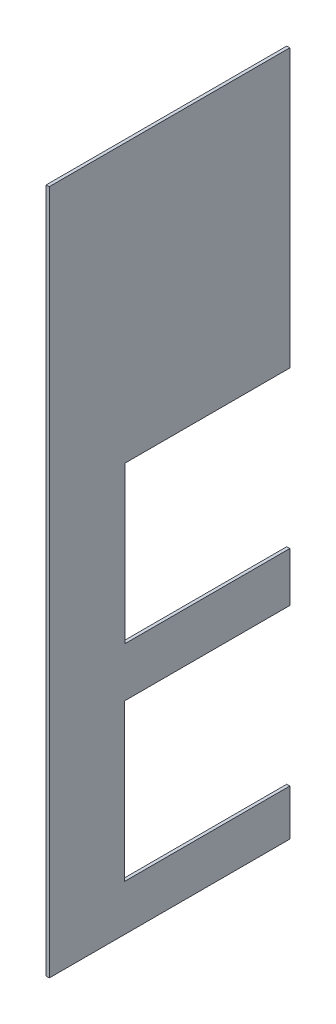
ISO-10303-21;
HEADER;
FILE_DESCRIPTION(('STEP AP214'),'2;1');
FILE_NAME('part.step','',(''),(''),'','','');
FILE_SCHEMA(('AUTOMOTIVE_DESIGN { 1 0 10303 214 1 1 1 1 }'));
ENDSEC;
DATA;
#1=APPLICATION_CONTEXT('core data for automotive mechanical design processes');
#2=APPLICATION_PROTOCOL_DEFINITION('international standard','automotive_design',2000,#1);
#3=PRODUCT_CONTEXT('',#1,'mechanical');
#4=PRODUCT('Part','Part','',(#3));
#5=PRODUCT_RELATED_PRODUCT_CATEGORY('part','',(#4));
#6=PRODUCT_DEFINITION_FORMATION('','',#4);
#7=PRODUCT_DEFINITION_CONTEXT('part definition',#1,'design');
#8=PRODUCT_DEFINITION('design','',#6,#7);
#9=PRODUCT_DEFINITION_SHAPE('','',#8);
#10=(LENGTH_UNIT() NAMED_UNIT(*) SI_UNIT(.MILLI.,.METRE.));
#11=(NAMED_UNIT(*) PLANE_ANGLE_UNIT() SI_UNIT($,.RADIAN.));
#12=(NAMED_UNIT(*) SI_UNIT($,.STERADIAN.) SOLID_ANGLE_UNIT());
#13=UNCERTAINTY_MEASURE_WITH_UNIT(LENGTH_MEASURE(1.E-05),#10,'distance_accuracy_value','');
#14=(GEOMETRIC_REPRESENTATION_CONTEXT(3) GLOBAL_UNCERTAINTY_ASSIGNED_CONTEXT((#13)) GLOBAL_UNIT_ASSIGNED_CONTEXT((#10,
#11,#12)) REPRESENTATION_CONTEXT('',''));
#15=CARTESIAN_POINT('',(0.,0.,0.));
#16=DIRECTION('',(0.,0.,1.));
#17=DIRECTION('',(1.,0.,0.));
#18=AXIS2_PLACEMENT_3D('',#15,#16,#17);
#19=CARTESIAN_POINT('',(1.,100.85,3.40000000000002));
#20=DIRECTION('',(0.,0.,-1.));
#21=DIRECTION('',(0.,1.,0.));
#22=AXIS2_PLACEMENT_3D('',#19,#20,#21);
#23=PLANE('',#22);
#24=DIRECTION('',(-1.,0.,0.));
#25=VECTOR('',#24,1.);
#26=CARTESIAN_POINT('',(1.,30.8070827212353,3.40000000000003));
#27=LINE('',#26,#25);
#28=CARTESIAN_POINT('',(1.,30.8070827212353,3.40000000000002));
#29=VERTEX_POINT('',#28);
#30=CARTESIAN_POINT('',(0.5,30.8070827212353,3.40000000000002));
#31=VERTEX_POINT('',#30);
#32=EDGE_CURVE('E195',#29,#31,#27,.T.);
#33=ORIENTED_EDGE('',*,*,#32,.F.);
#34=DIRECTION('',(0.,-1.,0.));
#35=VECTOR('',#34,1.);
#36=CARTESIAN_POINT('',(1.,100.85,3.40000000000002));
#37=LINE('',#36,#35);
#38=CARTESIAN_POINT('',(1.,22.832076617722,3.40000000000001));
#39=VERTEX_POINT('',#38);
#40=EDGE_CURVE('E217',#29,#39,#37,.T.);
#41=ORIENTED_EDGE('',*,*,#40,.T.);
#42=DIRECTION('',(1.,0.,0.));
#43=VECTOR('',#42,1.);
#44=CARTESIAN_POINT('',(1.,22.832076617722,3.40000000000003));
#45=LINE('',#44,#43);
#46=CARTESIAN_POINT('',(0.5,22.832076617722,3.40000000000001));
#47=VERTEX_POINT('',#46);
#48=EDGE_CURVE('E164',#47,#39,#45,.T.);
#49=ORIENTED_EDGE('',*,*,#48,.F.);
#50=DIRECTION('',(0.,-1.,0.));
#51=VECTOR('',#50,1.);
#52=CARTESIAN_POINT('',(0.5,100.85,3.40000000000002));
#53=LINE('',#52,#51);
#54=EDGE_CURVE('E233',#31,#47,#53,.T.);
#55=ORIENTED_EDGE('',*,*,#54,.F.);
#56=EDGE_LOOP('',(#33,#41,#49,#55));
#57=FACE_BOUND('',#56,.T.);
#58=ADVANCED_FACE('F38',(#57),#23,.T.);
#59=DIRECTION('',(-1.,0.,0.));
#60=VECTOR('',#59,1.);
#61=CARTESIAN_POINT('',(1.,-2.4179233822796,3.40000000000003));
#62=LINE('',#61,#60);
#63=CARTESIAN_POINT('',(1.,-2.4179233822796,3.40000000000003));
#64=VERTEX_POINT('',#63);
#65=CARTESIAN_POINT('',(0.5,-2.4179233822796,3.40000000000003));
#66=VERTEX_POINT('',#65);
#67=EDGE_CURVE('E190',#64,#66,#62,.T.);
#68=ORIENTED_EDGE('',*,*,#67,.F.);
#69=CARTESIAN_POINT('',(1.,-9.84999999999989,3.40000000000003));
#70=VERTEX_POINT('',#69);
#71=EDGE_CURVE('E212',#64,#70,#37,.T.);
#72=ORIENTED_EDGE('',*,*,#71,.T.);
#73=DIRECTION('',(-1.,0.,0.));
#74=VECTOR('',#73,1.);
#75=CARTESIAN_POINT('',(1.,-9.84999999999989,3.40000000000003));
#76=LINE('',#75,#74);
#77=CARTESIAN_POINT('',(0.5,-9.84999999999989,3.40000000000003));
#78=VERTEX_POINT('',#77);
#79=EDGE_CURVE('E234',#70,#78,#76,.T.);
#80=ORIENTED_EDGE('',*,*,#79,.T.);
#81=EDGE_CURVE('E229',#66,#78,#53,.T.);
#82=ORIENTED_EDGE('',*,*,#81,.F.);
#83=EDGE_LOOP('',(#68,#72,#80,#82));
#84=FACE_BOUND('',#83,.T.);
#85=ADVANCED_FACE('F274',(#84),#23,.T.);
#86=CARTESIAN_POINT('',(1.,-9.84999999999989,3.40000000000003));
#87=DIRECTION('',(0.,-1.,0.));
#88=DIRECTION('',(0.,0.,-1.));
#89=AXIS2_PLACEMENT_3D('',#86,#87,#88);
#90=PLANE('',#89);
#91=DIRECTION('',(0.,0.,1.));
#92=VECTOR('',#91,1.);
#93=CARTESIAN_POINT('',(0.5,-9.84999999999989,3.40000000000003));
#94=LINE('',#93,#92);
#95=CARTESIAN_POINT('',(0.5,-9.84999999999989,42.25));
#96=VERTEX_POINT('',#95);
#97=EDGE_CURVE('E198',#78,#96,#94,.T.);
#98=ORIENTED_EDGE('',*,*,#97,.F.);
#99=ORIENTED_EDGE('',*,*,#79,.F.);
#100=DIRECTION('',(0.,0.,1.));
#101=VECTOR('',#100,1.);
#102=CARTESIAN_POINT('',(1.,-9.84999999999989,3.40000000000003));
#103=LINE('',#102,#101);
#104=CARTESIAN_POINT('',(1.,-9.84999999999989,42.25));
#105=VERTEX_POINT('',#104);
#106=EDGE_CURVE('E199',#70,#105,#103,.T.);
#107=ORIENTED_EDGE('',*,*,#106,.T.);
#108=DIRECTION('',(-1.,0.,0.));
#109=VECTOR('',#108,1.);
#110=CARTESIAN_POINT('',(1.,-9.84999999999989,42.25));
#111=LINE('',#110,#109);
#112=EDGE_CURVE('E216',#105,#96,#111,.T.);
#113=ORIENTED_EDGE('',*,*,#112,.T.);
#114=EDGE_LOOP('',(#98,#99,#107,#113));
#115=FACE_BOUND('',#114,.T.);
#116=ADVANCED_FACE('F40',(#115),#90,.T.);
#117=DIRECTION('',(1.,0.,0.));
#118=VECTOR('',#117,1.);
#119=CARTESIAN_POINT('',(1.,56.0570827212335,3.40000000000002));
#120=LINE('',#119,#118);
#121=CARTESIAN_POINT('',(0.5,56.0570827212335,3.40000000000003));
#122=VERTEX_POINT('',#121);
#123=CARTESIAN_POINT('',(1.,56.0570827212335,3.40000000000003));
#124=VERTEX_POINT('',#123);
#125=EDGE_CURVE('E143',#122,#124,#120,.T.);
#126=ORIENTED_EDGE('',*,*,#125,.F.);
#127=CARTESIAN_POINT('',(0.5,100.85,3.40000000000002));
#128=VERTEX_POINT('',#127);
#129=EDGE_CURVE('E204',#128,#122,#53,.T.);
#130=ORIENTED_EDGE('',*,*,#129,.F.);
#131=DIRECTION('',(-1.,0.,0.));
#132=VECTOR('',#131,1.);
#133=CARTESIAN_POINT('',(1.,100.85,3.40000000000002));
#134=LINE('',#133,#132);
#135=CARTESIAN_POINT('',(1.,100.85,3.40000000000002));
#136=VERTEX_POINT('',#135);
#137=EDGE_CURVE('E238',#136,#128,#134,.T.);
#138=ORIENTED_EDGE('',*,*,#137,.F.);
#139=EDGE_CURVE('E213',#136,#124,#37,.T.);
#140=ORIENTED_EDGE('',*,*,#139,.T.);
#141=EDGE_LOOP('',(#126,#130,#138,#140));
#142=FACE_BOUND('',#141,.T.);
#143=ADVANCED_FACE('F306',(#142),#23,.T.);
#144=CARTESIAN_POINT('',(1.,100.85,42.25));
#145=DIRECTION('',(0.,1.,0.));
#146=DIRECTION('',(0.,0.,1.));
#147=AXIS2_PLACEMENT_3D('',#144,#145,#146);
#148=PLANE('',#147);
#149=DIRECTION('',(0.,0.,-1.));
#150=VECTOR('',#149,1.);
#151=CARTESIAN_POINT('',(0.5,100.85,42.25));
#152=LINE('',#151,#150);
#153=CARTESIAN_POINT('',(0.5,100.85,42.25));
#154=VERTEX_POINT('',#153);
#155=EDGE_CURVE('E225',#154,#128,#152,.T.);
#156=ORIENTED_EDGE('',*,*,#155,.F.);
#157=DIRECTION('',(-1.,0.,0.));
#158=VECTOR('',#157,1.);
#159=CARTESIAN_POINT('',(1.,100.85,42.25));
#160=LINE('',#159,#158);
#161=CARTESIAN_POINT('',(1.,100.85,42.25));
#162=VERTEX_POINT('',#161);
#163=EDGE_CURVE('E241',#162,#154,#160,.T.);
#164=ORIENTED_EDGE('',*,*,#163,.F.);
#165=DIRECTION('',(0.,0.,-1.));
#166=VECTOR('',#165,1.);
#167=CARTESIAN_POINT('',(1.,100.85,42.25));
#168=LINE('',#167,#166);
#169=EDGE_CURVE('E208',#162,#136,#168,.T.);
#170=ORIENTED_EDGE('',*,*,#169,.T.);
#171=ORIENTED_EDGE('',*,*,#137,.T.);
#172=EDGE_LOOP('',(#156,#164,#170,#171));
#173=FACE_BOUND('',#172,.T.);
#174=ADVANCED_FACE('F307',(#173),#148,.T.);
#175=CARTESIAN_POINT('',(1.,-9.84999999999989,42.25));
#176=DIRECTION('',(0.,0.,1.));
#177=DIRECTION('',(0.,-1.,0.));
#178=AXIS2_PLACEMENT_3D('',#175,#176,#177);
#179=PLANE('',#178);
#180=DIRECTION('',(0.,1.,0.));
#181=VECTOR('',#180,1.);
#182=CARTESIAN_POINT('',(0.5,-9.84999999999989,42.25));
#183=LINE('',#182,#181);
#184=EDGE_CURVE('E221',#96,#154,#183,.T.);
#185=ORIENTED_EDGE('',*,*,#184,.F.);
#186=ORIENTED_EDGE('',*,*,#112,.F.);
#187=DIRECTION('',(0.,1.,0.));
#188=VECTOR('',#187,1.);
#189=CARTESIAN_POINT('',(1.,-9.84999999999989,42.25));
#190=LINE('',#189,#188);
#191=EDGE_CURVE('E203',#105,#162,#190,.T.);
#192=ORIENTED_EDGE('',*,*,#191,.T.);
#193=ORIENTED_EDGE('',*,*,#163,.T.);
#194=EDGE_LOOP('',(#185,#186,#192,#193));
#195=FACE_BOUND('',#194,.T.);
#196=ADVANCED_FACE('F282',(#195),#179,.T.);
#197=CARTESIAN_POINT('',(1.,0.,0.));
#198=DIRECTION('',(-1.,0.,0.));
#199=DIRECTION('',(0.,0.,1.));
#200=AXIS2_PLACEMENT_3D('',#197,#198,#199);
#201=PLANE('',#200);
#202=ORIENTED_EDGE('',*,*,#40,.F.);
#203=DIRECTION('',(0.,4.37114345301024E-08,0.999999999999999));
#204=VECTOR('',#203,1.);
#205=CARTESIAN_POINT('',(1.,30.8070838842463,30.0065614418577));
#206=LINE('',#205,#204);
#207=CARTESIAN_POINT('',(1.,30.8070838842463,30.0065614418577));
#208=VERTEX_POINT('',#207);
#209=EDGE_CURVE('E137',#29,#208,#206,.T.);
#210=ORIENTED_EDGE('',*,*,#209,.T.);
#211=DIRECTION('',(0.,0.999999999999999,-4.37114218583463E-08));
#212=VECTOR('',#211,1.);
#213=CARTESIAN_POINT('',(1.,30.8070838842463,30.0065614418577));
#214=LINE('',#213,#212);
#215=CARTESIAN_POINT('',(1.,56.0570838842445,30.0065603381443));
#216=VERTEX_POINT('',#215);
#217=EDGE_CURVE('E131',#208,#216,#214,.T.);
#218=ORIENTED_EDGE('',*,*,#217,.T.);
#219=DIRECTION('',(0.,-4.37114381242467E-08,-0.999999999999999));
#220=VECTOR('',#219,1.);
#221=CARTESIAN_POINT('',(1.,56.0570838842445,30.0065603381443));
#222=LINE('',#221,#220);
#223=EDGE_CURVE('E140',#216,#124,#222,.T.);
#224=ORIENTED_EDGE('',*,*,#223,.T.);
#225=ORIENTED_EDGE('',*,*,#139,.F.);
#226=ORIENTED_EDGE('',*,*,#169,.F.);
#227=ORIENTED_EDGE('',*,*,#191,.F.);
#228=ORIENTED_EDGE('',*,*,#106,.F.);
#229=ORIENTED_EDGE('',*,*,#71,.F.);
#230=DIRECTION('',(0.,4.37114247184531E-08,0.999999999999999));
#231=VECTOR('',#230,1.);
#232=CARTESIAN_POINT('',(1.,-2.41792221489775,30.1065614418577));
#233=LINE('',#232,#231);
#234=CARTESIAN_POINT('',(1.,-2.41792221489775,30.1065614418577));
#235=VERTEX_POINT('',#234);
#236=EDGE_CURVE('E175',#64,#235,#233,.T.);
#237=ORIENTED_EDGE('',*,*,#236,.T.);
#238=DIRECTION('',(0.,0.999999999999999,-4.37114228201674E-08));
#239=VECTOR('',#238,1.);
#240=CARTESIAN_POINT('',(1.,-2.41792221489775,30.1065614418577));
#241=LINE('',#240,#239);
#242=CARTESIAN_POINT('',(1.,22.8320777851038,30.1065603381443));
#243=VERTEX_POINT('',#242);
#244=EDGE_CURVE('E166',#235,#243,#241,.T.);
#245=ORIENTED_EDGE('',*,*,#244,.T.);
#246=DIRECTION('',(0.,-4.37114246317689E-08,-0.999999999999999));
#247=VECTOR('',#246,1.);
#248=CARTESIAN_POINT('',(1.,22.8320777851038,30.1065603381443));
#249=LINE('',#248,#247);
#250=EDGE_CURVE('E170',#243,#39,#249,.T.);
#251=ORIENTED_EDGE('',*,*,#250,.T.);
#252=EDGE_LOOP('',(#202,#210,#218,#224,#225,#226,#227,#228,#229,#237,#245,#251));
#253=FACE_BOUND('',#252,.T.);
#254=ADVANCED_FACE('F150',(#253),#201,.F.);
#255=CARTESIAN_POINT('',(0.5,0.,0.));
#256=DIRECTION('',(-1.,0.,0.));
#257=DIRECTION('',(0.,0.,1.));
#258=AXIS2_PLACEMENT_3D('',#255,#256,#257);
#259=PLANE('',#258);
#260=DIRECTION('',(0.,4.37114345301024E-08,0.999999999999999));
#261=VECTOR('',#260,1.);
#262=CARTESIAN_POINT('',(0.5,30.8070825726164,-1.34662177293638E-06));
#263=LINE('',#262,#261);
#264=CARTESIAN_POINT('',(0.5,30.8070838842463,30.0065614418577));
#265=VERTEX_POINT('',#264);
#266=EDGE_CURVE('E11',#31,#265,#263,.T.);
#267=ORIENTED_EDGE('',*,*,#266,.F.);
#268=ORIENTED_EDGE('',*,*,#54,.T.);
#269=DIRECTION('',(0.,-4.37114246317689E-08,-0.999999999999999));
#270=VECTOR('',#269,1.);
#271=CARTESIAN_POINT('',(0.5,22.8320777851038,30.1065603381443));
#272=LINE('',#271,#270);
#273=CARTESIAN_POINT('',(0.5,22.8320777851038,30.1065603381443));
#274=VERTEX_POINT('',#273);
#275=EDGE_CURVE('E171',#274,#47,#272,.T.);
#276=ORIENTED_EDGE('',*,*,#275,.F.);
#277=DIRECTION('',(0.,0.999999999999999,-4.37114228201674E-08));
#278=VECTOR('',#277,1.);
#279=CARTESIAN_POINT('',(0.5,-2.41792221489775,30.1065614418577));
#280=LINE('',#279,#278);
#281=CARTESIAN_POINT('',(0.5,-2.41792221489775,30.1065614418577));
#282=VERTEX_POINT('',#281);
#283=EDGE_CURVE('E62',#282,#274,#280,.T.);
#284=ORIENTED_EDGE('',*,*,#283,.F.);
#285=DIRECTION('',(0.,4.37114247184531E-08,0.999999999999999));
#286=VECTOR('',#285,1.);
#287=CARTESIAN_POINT('',(0.5,-2.41792353089844,1.05690882395843E-07));
#288=LINE('',#287,#286);
#289=EDGE_CURVE('E47',#66,#282,#288,.T.);
#290=ORIENTED_EDGE('',*,*,#289,.F.);
#291=ORIENTED_EDGE('',*,*,#81,.T.);
#292=ORIENTED_EDGE('',*,*,#97,.T.);
#293=ORIENTED_EDGE('',*,*,#184,.T.);
#294=ORIENTED_EDGE('',*,*,#155,.T.);
#295=ORIENTED_EDGE('',*,*,#129,.T.);
#296=DIRECTION('',(0.,-4.37114381242467E-08,-0.999999999999999));
#297=VECTOR('',#296,1.);
#298=CARTESIAN_POINT('',(0.5,56.0570838842445,30.0065603381443));
#299=LINE('',#298,#297);
#300=CARTESIAN_POINT('',(0.5,56.0570838842445,30.0065603381443));
#301=VERTEX_POINT('',#300);
#302=EDGE_CURVE('E152',#301,#122,#299,.T.);
#303=ORIENTED_EDGE('',*,*,#302,.F.);
#304=DIRECTION('',(0.,0.999999999999999,-4.37114218583463E-08));
#305=VECTOR('',#304,1.);
#306=CARTESIAN_POINT('',(0.5,30.8070838842463,30.0065614418577));
#307=LINE('',#306,#305);
#308=EDGE_CURVE('E54',#265,#301,#307,.T.);
#309=ORIENTED_EDGE('',*,*,#308,.F.);
#310=EDGE_LOOP('',(#267,#268,#276,#284,#290,#291,#292,#293,#294,#295,#303,#309));
#311=FACE_BOUND('',#310,.T.);
#312=ADVANCED_FACE('F257',(#311),#259,.T.);
#313=CARTESIAN_POINT('',(1.,-2.41792221489775,30.1065614418577));
#314=DIRECTION('',(0.,4.37114228201674E-08,0.999999999999999));
#315=DIRECTION('',(0.,-0.999999999999999,4.37114228201674E-08));
#316=AXIS2_PLACEMENT_3D('',#313,#314,#315);
#317=PLANE('',#316);
#318=ORIENTED_EDGE('',*,*,#283,.T.);
#319=DIRECTION('',(-1.,0.,0.));
#320=VECTOR('',#319,1.);
#321=CARTESIAN_POINT('',(1.,22.8320777851038,30.1065603381443));
#322=LINE('',#321,#320);
#323=EDGE_CURVE('E179',#243,#274,#322,.T.);
#324=ORIENTED_EDGE('',*,*,#323,.F.);
#325=ORIENTED_EDGE('',*,*,#244,.F.);
#326=DIRECTION('',(-1.,0.,0.));
#327=VECTOR('',#326,1.);
#328=CARTESIAN_POINT('',(1.,-2.41792221489775,30.1065614418577));
#329=LINE('',#328,#327);
#330=EDGE_CURVE('E161',#235,#282,#329,.T.);
#331=ORIENTED_EDGE('',*,*,#330,.T.);
#332=EDGE_LOOP('',(#318,#324,#325,#331));
#333=FACE_BOUND('',#332,.T.);
#334=ADVANCED_FACE('F254',(#333),#317,.F.);
#335=CARTESIAN_POINT('',(1.,-2.41792221489775,30.1065614418577));
#336=DIRECTION('',(0.,-0.999999999999999,4.37114247184531E-08));
#337=DIRECTION('',(0.,-4.37114247184531E-08,-0.999999999999999));
#338=AXIS2_PLACEMENT_3D('',#335,#336,#337);
#339=PLANE('',#338);
#340=ORIENTED_EDGE('',*,*,#67,.T.);
#341=ORIENTED_EDGE('',*,*,#289,.T.);
#342=ORIENTED_EDGE('',*,*,#330,.F.);
#343=ORIENTED_EDGE('',*,*,#236,.F.);
#344=EDGE_LOOP('',(#340,#341,#342,#343));
#345=FACE_BOUND('',#344,.T.);
#346=ADVANCED_FACE('F249',(#345),#339,.F.);
#347=CARTESIAN_POINT('',(1.,22.8320777851038,30.1065603381443));
#348=DIRECTION('',(0.,0.999999999999999,-4.37114246317689E-08));
#349=DIRECTION('',(0.,4.37114246317689E-08,0.999999999999999));
#350=AXIS2_PLACEMENT_3D('',#347,#348,#349);
#351=PLANE('',#350);
#352=ORIENTED_EDGE('',*,*,#48,.T.);
#353=ORIENTED_EDGE('',*,*,#250,.F.);
#354=ORIENTED_EDGE('',*,*,#323,.T.);
#355=ORIENTED_EDGE('',*,*,#275,.T.);
#356=EDGE_LOOP('',(#352,#353,#354,#355));
#357=FACE_BOUND('',#356,.T.);
#358=ADVANCED_FACE('F262',(#357),#351,.F.);
#359=CARTESIAN_POINT('',(1.,30.8070838842463,30.0065614418577));
#360=DIRECTION('',(0.,4.37114218583463E-08,0.999999999999999));
#361=DIRECTION('',(0.,-0.999999999999999,4.37114218583463E-08));
#362=AXIS2_PLACEMENT_3D('',#359,#360,#361);
#363=PLANE('',#362);
#364=ORIENTED_EDGE('',*,*,#308,.T.);
#365=DIRECTION('',(-1.,0.,0.));
#366=VECTOR('',#365,1.);
#367=CARTESIAN_POINT('',(1.,56.0570838842445,30.0065603381443));
#368=LINE('',#367,#366);
#369=EDGE_CURVE('E127',#216,#301,#368,.T.);
#370=ORIENTED_EDGE('',*,*,#369,.F.);
#371=ORIENTED_EDGE('',*,*,#217,.F.);
#372=DIRECTION('',(-1.,0.,0.));
#373=VECTOR('',#372,1.);
#374=CARTESIAN_POINT('',(1.,30.8070838842463,30.0065614418577));
#375=LINE('',#374,#373);
#376=EDGE_CURVE('E136',#208,#265,#375,.T.);
#377=ORIENTED_EDGE('',*,*,#376,.T.);
#378=EDGE_LOOP('',(#364,#370,#371,#377));
#379=FACE_BOUND('',#378,.T.);
#380=ADVANCED_FACE('F129',(#379),#363,.F.);
#381=CARTESIAN_POINT('',(1.,30.8070838842463,30.0065614418577));
#382=DIRECTION('',(0.,-0.999999999999999,4.37114345301024E-08));
#383=DIRECTION('',(0.,-4.37114345301024E-08,-0.999999999999999));
#384=AXIS2_PLACEMENT_3D('',#381,#382,#383);
#385=PLANE('',#384);
#386=ORIENTED_EDGE('',*,*,#32,.T.);
#387=ORIENTED_EDGE('',*,*,#266,.T.);
#388=ORIENTED_EDGE('',*,*,#376,.F.);
#389=ORIENTED_EDGE('',*,*,#209,.F.);
#390=EDGE_LOOP('',(#386,#387,#388,#389));
#391=FACE_BOUND('',#390,.T.);
#392=ADVANCED_FACE('F332',(#391),#385,.F.);
#393=CARTESIAN_POINT('',(1.,56.0570838842445,30.0065603381443));
#394=DIRECTION('',(0.,0.999999999999999,-4.37114381242467E-08));
#395=DIRECTION('',(0.,4.37114381242467E-08,0.999999999999999));
#396=AXIS2_PLACEMENT_3D('',#393,#394,#395);
#397=PLANE('',#396);
#398=ORIENTED_EDGE('',*,*,#125,.T.);
#399=ORIENTED_EDGE('',*,*,#223,.F.);
#400=ORIENTED_EDGE('',*,*,#369,.T.);
#401=ORIENTED_EDGE('',*,*,#302,.T.);
#402=EDGE_LOOP('',(#398,#399,#400,#401));
#403=FACE_BOUND('',#402,.T.);
#404=ADVANCED_FACE('F141',(#403),#397,.F.);
#405=CLOSED_SHELL('',(#58,#85,#116,#143,#174,#196,#254,#312,#334,#346,#358,#380,#392,#404));
#406=MANIFOLD_SOLID_BREP('B2',#405);
#407=ADVANCED_BREP_SHAPE_REPRESENTATION('',(#18,#406),#14);
#408=SHAPE_DEFINITION_REPRESENTATION(#9,#407);
ENDSEC;
END-ISO-10303-21;
